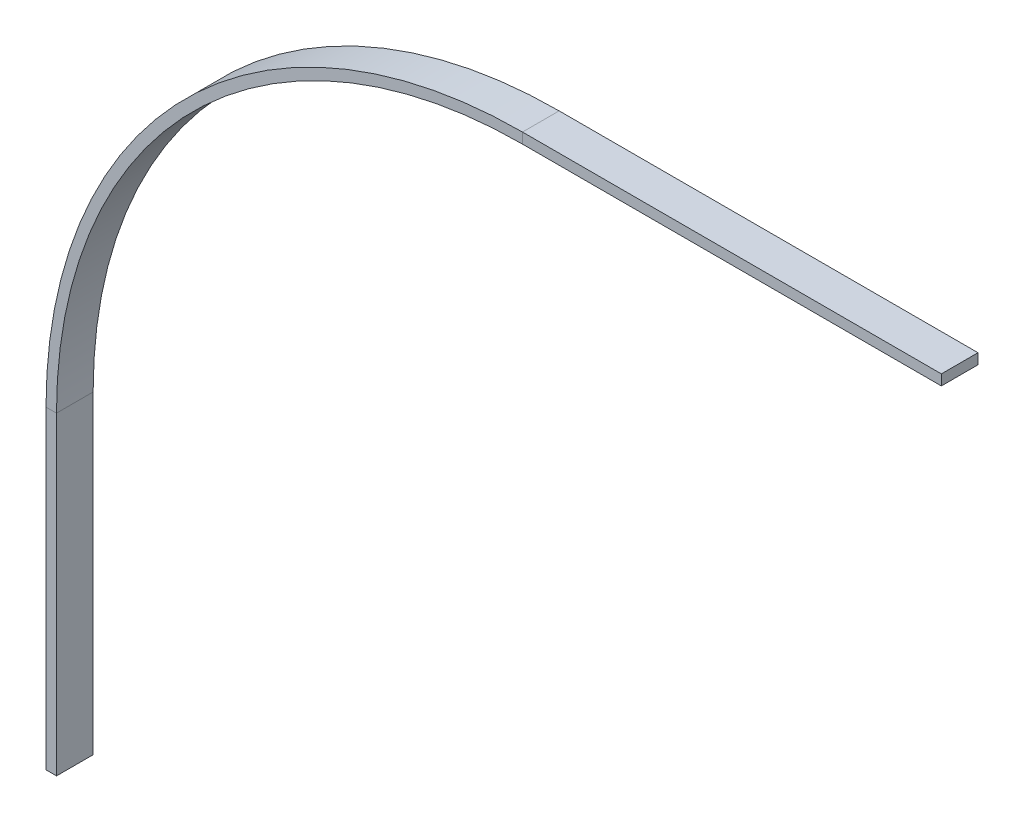
ISO-10303-21;
HEADER;
FILE_DESCRIPTION(('STEP AP214'),'2;1');
FILE_NAME('part.step','',(''),(''),'','','');
FILE_SCHEMA(('AUTOMOTIVE_DESIGN { 1 0 10303 214 1 1 1 1 }'));
ENDSEC;
DATA;
#1=APPLICATION_CONTEXT('core data for automotive mechanical design processes');
#2=APPLICATION_PROTOCOL_DEFINITION('international standard','automotive_design',2000,#1);
#3=PRODUCT_CONTEXT('',#1,'mechanical');
#4=PRODUCT('Part','Part','',(#3));
#5=PRODUCT_RELATED_PRODUCT_CATEGORY('part','',(#4));
#6=PRODUCT_DEFINITION_FORMATION('','',#4);
#7=PRODUCT_DEFINITION_CONTEXT('part definition',#1,'design');
#8=PRODUCT_DEFINITION('design','',#6,#7);
#9=PRODUCT_DEFINITION_SHAPE('','',#8);
#10=(LENGTH_UNIT() NAMED_UNIT(*) SI_UNIT(.MILLI.,.METRE.));
#11=(NAMED_UNIT(*) PLANE_ANGLE_UNIT() SI_UNIT($,.RADIAN.));
#12=(NAMED_UNIT(*) SI_UNIT($,.STERADIAN.) SOLID_ANGLE_UNIT());
#13=UNCERTAINTY_MEASURE_WITH_UNIT(LENGTH_MEASURE(1.E-05),#10,'distance_accuracy_value','');
#14=(GEOMETRIC_REPRESENTATION_CONTEXT(3) GLOBAL_UNCERTAINTY_ASSIGNED_CONTEXT((#13)) GLOBAL_UNIT_ASSIGNED_CONTEXT((#10,
#11,#12)) REPRESENTATION_CONTEXT('',''));
#15=CARTESIAN_POINT('',(0.,0.,0.));
#16=DIRECTION('',(0.,0.,1.));
#17=DIRECTION('',(1.,0.,0.));
#18=AXIS2_PLACEMENT_3D('',#15,#16,#17);
#19=CARTESIAN_POINT('',(40.0000000464551,74.5019277988441,-7.5));
#20=DIRECTION('',(0.,0.,-1.));
#21=DIRECTION('',(-1.,0.,0.));
#22=AXIS2_PLACEMENT_3D('',#19,#20,#21);
#23=PLANE('',#22);
#24=DIRECTION('',(4.81949710834372E-05,0.999999998838622,0.));
#25=VECTOR('',#24,1.);
#26=CARTESIAN_POINT('',(40.0000000464551,74.5019277988441,-7.5));
#27=LINE('',#26,#25);
#28=CARTESIAN_POINT('',(40.0000000464551,74.5019277988441,-7.5));
#29=VERTEX_POINT('',#28);
#30=CARTESIAN_POINT('',(40.0000482414262,75.5019277976828,-7.5));
#31=VERTEX_POINT('',#30);
#32=EDGE_CURVE('E12',#29,#31,#27,.T.);
#33=ORIENTED_EDGE('',*,*,#32,.F.);
#34=CARTESIAN_POINT('',(39.9978552729575,29.9999093103118,-7.5));
#35=DIRECTION('',(0.,0.,-1.));
#36=DIRECTION('',(-1.,0.,0.));
#37=AXIS2_PLACEMENT_3D('',#34,#35,#36);
#38=CIRCLE('',#37,44.502018540216);
#39=CARTESIAN_POINT('',(-4.50416326716609,30.,-7.5));
#40=VERTEX_POINT('',#39);
#41=EDGE_CURVE('E173',#40,#29,#38,.T.);
#42=ORIENTED_EDGE('',*,*,#41,.F.);
#43=DIRECTION('',(0.999999999997924,-2.03787669786561E-06,0.));
#44=VECTOR('',#43,1.);
#45=CARTESIAN_POINT('',(-5.50416327707822,30.0000020378767,-7.5));
#46=LINE('',#45,#44);
#47=CARTESIAN_POINT('',(-5.50416327707822,30.0000020378767,-7.5));
#48=VERTEX_POINT('',#47);
#49=EDGE_CURVE('E61',#48,#40,#46,.T.);
#50=ORIENTED_EDGE('',*,*,#49,.F.);
#51=CARTESIAN_POINT('',(39.9978552729575,29.9999093103118,-7.5));
#52=DIRECTION('',(0.,0.,1.));
#53=DIRECTION('',(1.,0.,0.));
#54=AXIS2_PLACEMENT_3D('',#51,#52,#53);
#55=CIRCLE('',#54,45.502018540216);
#56=EDGE_CURVE('E230',#48,#31,#55,.F.);
#57=ORIENTED_EDGE('',*,*,#56,.T.);
#58=EDGE_LOOP('',(#33,#42,#50,#57));
#59=FACE_BOUND('',#58,.T.);
#60=ADVANCED_FACE('F51',(#59),#23,.T.);
#61=CARTESIAN_POINT('',(-5.50416327707822,30.0000020378767,-7.5));
#62=DIRECTION('',(0.,0.,-1.));
#63=DIRECTION('',(-1.,0.,0.));
#64=AXIS2_PLACEMENT_3D('',#61,#62,#63);
#65=PLANE('',#64);
#66=DIRECTION('',(0.999999998838622,-4.81949711032131E-05,0.));
#67=VECTOR('',#66,1.);
#68=CARTESIAN_POINT('',(80.,74.5,-7.5));
#69=LINE('',#68,#67);
#70=CARTESIAN_POINT('',(80.,74.5,-7.5));
#71=VERTEX_POINT('',#70);
#72=EDGE_CURVE('E241',#29,#71,#69,.T.);
#73=ORIENTED_EDGE('',*,*,#72,.F.);
#74=ORIENTED_EDGE('',*,*,#32,.T.);
#75=DIRECTION('',(0.999999998838623,-4.81949711032131E-05,0.));
#76=VECTOR('',#75,1.);
#77=CARTESIAN_POINT('',(80.0000481949711,75.4999999988386,-7.5));
#78=LINE('',#77,#76);
#79=CARTESIAN_POINT('',(80.0000481949711,75.4999999988386,-7.5));
#80=VERTEX_POINT('',#79);
#81=EDGE_CURVE('E233',#31,#80,#78,.T.);
#82=ORIENTED_EDGE('',*,*,#81,.T.);
#83=DIRECTION('',(-4.8194971097315E-05,-0.999999998838622,0.));
#84=VECTOR('',#83,1.);
#85=CARTESIAN_POINT('',(80.0000481949711,75.4999999988386,-7.5));
#86=LINE('',#85,#84);
#87=EDGE_CURVE('E130',#80,#71,#86,.T.);
#88=ORIENTED_EDGE('',*,*,#87,.T.);
#89=EDGE_LOOP('',(#73,#74,#82,#88));
#90=FACE_BOUND('',#89,.T.);
#91=ADVANCED_FACE('F296',(#90),#65,.T.);
#92=CARTESIAN_POINT('',(-4.50416326716609,30.,-4.));
#93=DIRECTION('',(0.,0.,1.));
#94=DIRECTION('',(1.,0.,0.));
#95=AXIS2_PLACEMENT_3D('',#92,#93,#94);
#96=PLANE('',#95);
#97=DIRECTION('',(-0.999999999997924,2.03787669786561E-06,0.));
#98=VECTOR('',#97,1.);
#99=CARTESIAN_POINT('',(-4.50416326716609,30.,-4.));
#100=LINE('',#99,#98);
#101=CARTESIAN_POINT('',(-4.50416326716609,30.,-4.));
#102=VERTEX_POINT('',#101);
#103=CARTESIAN_POINT('',(-5.50416327707822,30.0000020378767,-4.));
#104=VERTEX_POINT('',#103);
#105=EDGE_CURVE('E109',#102,#104,#100,.T.);
#106=ORIENTED_EDGE('',*,*,#105,.F.);
#107=CARTESIAN_POINT('',(39.9978552729575,29.9999093103118,-4.));
#108=DIRECTION('',(0.,0.,-1.));
#109=DIRECTION('',(-1.,0.,0.));
#110=AXIS2_PLACEMENT_3D('',#107,#108,#109);
#111=CIRCLE('',#110,44.502018540216);
#112=CARTESIAN_POINT('',(40.0000000464551,74.5019277988441,-4.));
#113=VERTEX_POINT('',#112);
#114=EDGE_CURVE('E199',#102,#113,#111,.T.);
#115=ORIENTED_EDGE('',*,*,#114,.T.);
#116=DIRECTION('',(-4.81949710834372E-05,-0.999999998838622,0.));
#117=VECTOR('',#116,1.);
#118=CARTESIAN_POINT('',(40.0000482414262,75.5019277976828,-4.));
#119=LINE('',#118,#117);
#120=CARTESIAN_POINT('',(40.0000482414262,75.5019277976828,-4.));
#121=VERTEX_POINT('',#120);
#122=EDGE_CURVE('E119',#121,#113,#119,.T.);
#123=ORIENTED_EDGE('',*,*,#122,.F.);
#124=CARTESIAN_POINT('',(39.9978552729575,29.9999093103118,-4.));
#125=DIRECTION('',(0.,0.,1.));
#126=DIRECTION('',(1.,0.,0.));
#127=AXIS2_PLACEMENT_3D('',#124,#125,#126);
#128=CIRCLE('',#127,45.502018540216);
#129=EDGE_CURVE('E222',#104,#121,#128,.F.);
#130=ORIENTED_EDGE('',*,*,#129,.F.);
#131=EDGE_LOOP('',(#106,#115,#123,#130));
#132=FACE_BOUND('',#131,.T.);
#133=ADVANCED_FACE('F249',(#132),#96,.T.);
#134=CARTESIAN_POINT('',(40.0000482414262,75.5019277976828,-4.));
#135=DIRECTION('',(0.,0.,1.));
#136=DIRECTION('',(1.,0.,0.));
#137=AXIS2_PLACEMENT_3D('',#134,#135,#136);
#138=PLANE('',#137);
#139=DIRECTION('',(-0.000138775570866489,0.99999999037067,0.));
#140=VECTOR('',#139,1.);
#141=CARTESIAN_POINT('',(-4.5,0.,-4.));
#142=LINE('',#141,#140);
#143=CARTESIAN_POINT('',(-4.5,0.,-4.));
#144=VERTEX_POINT('',#143);
#145=EDGE_CURVE('E153',#144,#102,#142,.T.);
#146=ORIENTED_EDGE('',*,*,#145,.T.);
#147=ORIENTED_EDGE('',*,*,#105,.T.);
#148=DIRECTION('',(-0.000138775570866489,0.999999990370671,0.));
#149=VECTOR('',#148,1.);
#150=CARTESIAN_POINT('',(-5.49999999037067,-0.000138775570866489,-4.));
#151=LINE('',#150,#149);
#152=CARTESIAN_POINT('',(-5.49999999037067,-0.000138775570866489,-4.));
#153=VERTEX_POINT('',#152);
#154=EDGE_CURVE('E217',#153,#104,#151,.T.);
#155=ORIENTED_EDGE('',*,*,#154,.F.);
#156=DIRECTION('',(-0.99999999037067,-0.000138775570866489,0.));
#157=VECTOR('',#156,1.);
#158=CARTESIAN_POINT('',(-4.5,0.,-4.));
#159=LINE('',#158,#157);
#160=EDGE_CURVE('E214',#144,#153,#159,.T.);
#161=ORIENTED_EDGE('',*,*,#160,.F.);
#162=EDGE_LOOP('',(#146,#147,#155,#161));
#163=FACE_BOUND('',#162,.T.);
#164=ADVANCED_FACE('F303',(#163),#138,.T.);
#165=CARTESIAN_POINT('',(80.,74.5,-7.5));
#166=DIRECTION('',(-4.81949711032131E-05,-0.999999998838623,0.));
#167=DIRECTION('',(0.999999998838622,-4.81949711032131E-05,0.));
#168=AXIS2_PLACEMENT_3D('',#165,#166,#167);
#169=PLANE('',#168);
#170=DIRECTION('',(0.999999998838622,-4.81949711032131E-05,0.));
#171=VECTOR('',#170,1.);
#172=CARTESIAN_POINT('',(80.,74.5,-4.));
#173=LINE('',#172,#171);
#174=CARTESIAN_POINT('',(80.,74.5,-4.));
#175=VERTEX_POINT('',#174);
#176=EDGE_CURVE('E183',#113,#175,#173,.T.);
#177=ORIENTED_EDGE('',*,*,#176,.F.);
#178=DIRECTION('',(0.,0.,1.));
#179=VECTOR('',#178,1.);
#180=CARTESIAN_POINT('',(40.0000000464551,74.5019277988441,-7.5));
#181=LINE('',#180,#179);
#182=EDGE_CURVE('E195',#29,#113,#181,.T.);
#183=ORIENTED_EDGE('',*,*,#182,.F.);
#184=ORIENTED_EDGE('',*,*,#72,.T.);
#185=DIRECTION('',(0.,0.,1.));
#186=VECTOR('',#185,1.);
#187=CARTESIAN_POINT('',(80.,74.5,-7.5));
#188=LINE('',#187,#186);
#189=EDGE_CURVE('E177',#71,#175,#188,.T.);
#190=ORIENTED_EDGE('',*,*,#189,.T.);
#191=EDGE_LOOP('',(#177,#183,#184,#190));
#192=FACE_BOUND('',#191,.T.);
#193=ADVANCED_FACE('F254',(#192),#169,.T.);
#194=CARTESIAN_POINT('',(39.9978552729575,29.9999093103118,-7.5));
#195=DIRECTION('',(0.,0.,1.));
#196=DIRECTION('',(1.,0.,0.));
#197=AXIS2_PLACEMENT_3D('',#194,#195,#196);
#198=CYLINDRICAL_SURFACE('',#197,44.502018540216);
#199=ORIENTED_EDGE('',*,*,#114,.F.);
#200=DIRECTION('',(0.,0.,1.));
#201=VECTOR('',#200,1.);
#202=CARTESIAN_POINT('',(-4.50416326716609,30.,-7.5));
#203=LINE('',#202,#201);
#204=EDGE_CURVE('E157',#40,#102,#203,.T.);
#205=ORIENTED_EDGE('',*,*,#204,.F.);
#206=ORIENTED_EDGE('',*,*,#41,.T.);
#207=ORIENTED_EDGE('',*,*,#182,.T.);
#208=EDGE_LOOP('',(#199,#205,#206,#207));
#209=FACE_BOUND('',#208,.T.);
#210=ADVANCED_FACE('F252',(#209),#198,.F.);
#211=CARTESIAN_POINT('',(-4.5,0.,-7.5));
#212=DIRECTION('',(0.99999999037067,0.000138775570866489,0.));
#213=DIRECTION('',(-0.000138775570866489,0.999999990370671,0.));
#214=AXIS2_PLACEMENT_3D('',#211,#212,#213);
#215=PLANE('',#214);
#216=ORIENTED_EDGE('',*,*,#145,.F.);
#217=DIRECTION('',(0.,0.,1.));
#218=VECTOR('',#217,1.);
#219=CARTESIAN_POINT('',(-4.5,0.,-7.5));
#220=LINE('',#219,#218);
#221=CARTESIAN_POINT('',(-4.5,0.,-7.5));
#222=VERTEX_POINT('',#221);
#223=EDGE_CURVE('E147',#222,#144,#220,.T.);
#224=ORIENTED_EDGE('',*,*,#223,.F.);
#225=DIRECTION('',(-0.000138775570866489,0.99999999037067,0.));
#226=VECTOR('',#225,1.);
#227=CARTESIAN_POINT('',(-4.5,0.,-7.5));
#228=LINE('',#227,#226);
#229=EDGE_CURVE('E151',#222,#40,#228,.T.);
#230=ORIENTED_EDGE('',*,*,#229,.T.);
#231=ORIENTED_EDGE('',*,*,#204,.T.);
#232=EDGE_LOOP('',(#216,#224,#230,#231));
#233=FACE_BOUND('',#232,.T.);
#234=ADVANCED_FACE('F149',(#233),#215,.T.);
#235=CARTESIAN_POINT('',(-4.5,0.,-7.5));
#236=DIRECTION('',(-0.000138775570866489,0.99999999037067,0.));
#237=DIRECTION('',(-0.999999990370671,-0.000138775570866489,0.));
#238=AXIS2_PLACEMENT_3D('',#235,#236,#237);
#239=PLANE('',#238);
#240=ORIENTED_EDGE('',*,*,#160,.T.);
#241=DIRECTION('',(0.,0.,1.));
#242=VECTOR('',#241,1.);
#243=CARTESIAN_POINT('',(-5.49999999037067,-0.000138775570866489,-7.5));
#244=LINE('',#243,#242);
#245=CARTESIAN_POINT('',(-5.49999999037067,-0.000138775570866489,-7.5));
#246=VERTEX_POINT('',#245);
#247=EDGE_CURVE('E158',#246,#153,#244,.T.);
#248=ORIENTED_EDGE('',*,*,#247,.F.);
#249=DIRECTION('',(-0.99999999037067,-0.000138775570866489,0.));
#250=VECTOR('',#249,1.);
#251=CARTESIAN_POINT('',(-4.5,0.,-7.5));
#252=LINE('',#251,#250);
#253=EDGE_CURVE('E161',#222,#246,#252,.T.);
#254=ORIENTED_EDGE('',*,*,#253,.F.);
#255=ORIENTED_EDGE('',*,*,#223,.T.);
#256=EDGE_LOOP('',(#240,#248,#254,#255));
#257=FACE_BOUND('',#256,.T.);
#258=ADVANCED_FACE('F162',(#257),#239,.F.);
#259=CARTESIAN_POINT('',(-5.49999999037067,-0.000138775570866489,-7.5));
#260=DIRECTION('',(0.99999999037067,0.000138775570866489,0.));
#261=DIRECTION('',(-0.000138775570866489,0.99999999037067,0.));
#262=AXIS2_PLACEMENT_3D('',#259,#260,#261);
#263=PLANE('',#262);
#264=ORIENTED_EDGE('',*,*,#154,.T.);
#265=DIRECTION('',(0.,0.,1.));
#266=VECTOR('',#265,1.);
#267=CARTESIAN_POINT('',(-5.50416327707822,30.0000020378767,-7.5));
#268=LINE('',#267,#266);
#269=EDGE_CURVE('E281',#48,#104,#268,.T.);
#270=ORIENTED_EDGE('',*,*,#269,.F.);
#271=DIRECTION('',(-0.000138775570866489,0.999999990370671,0.));
#272=VECTOR('',#271,1.);
#273=CARTESIAN_POINT('',(-5.49999999037067,-0.000138775570866489,-7.5));
#274=LINE('',#273,#272);
#275=EDGE_CURVE('E168',#246,#48,#274,.T.);
#276=ORIENTED_EDGE('',*,*,#275,.F.);
#277=ORIENTED_EDGE('',*,*,#247,.T.);
#278=EDGE_LOOP('',(#264,#270,#276,#277));
#279=FACE_BOUND('',#278,.T.);
#280=ADVANCED_FACE('F320',(#279),#263,.F.);
#281=CARTESIAN_POINT('',(39.9978552729575,29.9999093103118,-7.5));
#282=DIRECTION('',(0.,0.,1.));
#283=DIRECTION('',(1.,0.,0.));
#284=AXIS2_PLACEMENT_3D('',#281,#282,#283);
#285=CYLINDRICAL_SURFACE('',#284,45.502018540216);
#286=ORIENTED_EDGE('',*,*,#129,.T.);
#287=DIRECTION('',(0.,0.,1.));
#288=VECTOR('',#287,1.);
#289=CARTESIAN_POINT('',(40.0000482414262,75.5019277976828,-7.5));
#290=LINE('',#289,#288);
#291=EDGE_CURVE('E278',#31,#121,#290,.T.);
#292=ORIENTED_EDGE('',*,*,#291,.F.);
#293=ORIENTED_EDGE('',*,*,#56,.F.);
#294=ORIENTED_EDGE('',*,*,#269,.T.);
#295=EDGE_LOOP('',(#286,#292,#293,#294));
#296=FACE_BOUND('',#295,.T.);
#297=ADVANCED_FACE('F276',(#296),#285,.T.);
#298=CARTESIAN_POINT('',(80.0000481949711,75.4999999988386,-7.5));
#299=DIRECTION('',(-4.81949711032131E-05,-0.999999998838622,0.));
#300=DIRECTION('',(0.999999998838622,-4.81949711032131E-05,0.));
#301=AXIS2_PLACEMENT_3D('',#298,#299,#300);
#302=PLANE('',#301);
#303=DIRECTION('',(0.999999998838623,-4.81949711032131E-05,0.));
#304=VECTOR('',#303,1.);
#305=CARTESIAN_POINT('',(80.0000481949711,75.4999999988386,-4.));
#306=LINE('',#305,#304);
#307=CARTESIAN_POINT('',(80.0000481949711,75.4999999988386,-4.));
#308=VERTEX_POINT('',#307);
#309=EDGE_CURVE('E262',#121,#308,#306,.T.);
#310=ORIENTED_EDGE('',*,*,#309,.T.);
#311=DIRECTION('',(0.,0.,1.));
#312=VECTOR('',#311,1.);
#313=CARTESIAN_POINT('',(80.0000481949711,75.4999999988386,-7.5));
#314=LINE('',#313,#312);
#315=EDGE_CURVE('E284',#80,#308,#314,.T.);
#316=ORIENTED_EDGE('',*,*,#315,.F.);
#317=ORIENTED_EDGE('',*,*,#81,.F.);
#318=ORIENTED_EDGE('',*,*,#291,.T.);
#319=EDGE_LOOP('',(#310,#316,#317,#318));
#320=FACE_BOUND('',#319,.T.);
#321=ADVANCED_FACE('F282',(#320),#302,.F.);
#322=CARTESIAN_POINT('',(80.0000481949711,75.4999999988386,-7.5));
#323=DIRECTION('',(-0.999999998838623,4.8194971097315E-05,0.));
#324=DIRECTION('',(-4.8194971097315E-05,-0.999999998838622,0.));
#325=AXIS2_PLACEMENT_3D('',#322,#323,#324);
#326=PLANE('',#325);
#327=DIRECTION('',(-4.8194971097315E-05,-0.999999998838622,0.));
#328=VECTOR('',#327,1.);
#329=CARTESIAN_POINT('',(80.0000481949711,75.4999999988386,-4.));
#330=LINE('',#329,#328);
#331=EDGE_CURVE('E258',#308,#175,#330,.T.);
#332=ORIENTED_EDGE('',*,*,#331,.T.);
#333=ORIENTED_EDGE('',*,*,#189,.F.);
#334=ORIENTED_EDGE('',*,*,#87,.F.);
#335=ORIENTED_EDGE('',*,*,#315,.T.);
#336=EDGE_LOOP('',(#332,#333,#334,#335));
#337=FACE_BOUND('',#336,.T.);
#338=ADVANCED_FACE('F292',(#337),#326,.F.);
#339=CARTESIAN_POINT('',(39.9978552729575,29.9999093103118,-7.5));
#340=DIRECTION('',(0.,0.,1.));
#341=DIRECTION('',(1.,0.,0.));
#342=AXIS2_PLACEMENT_3D('',#339,#340,#341);
#343=PLANE('',#342);
#344=ORIENTED_EDGE('',*,*,#275,.T.);
#345=ORIENTED_EDGE('',*,*,#49,.T.);
#346=ORIENTED_EDGE('',*,*,#229,.F.);
#347=ORIENTED_EDGE('',*,*,#253,.T.);
#348=EDGE_LOOP('',(#344,#345,#346,#347));
#349=FACE_BOUND('',#348,.T.);
#350=ADVANCED_FACE('F170',(#349),#343,.F.);
#351=CARTESIAN_POINT('',(39.9978552729575,29.9999093103118,-4.));
#352=DIRECTION('',(0.,0.,1.));
#353=DIRECTION('',(1.,0.,0.));
#354=AXIS2_PLACEMENT_3D('',#351,#352,#353);
#355=PLANE('',#354);
#356=ORIENTED_EDGE('',*,*,#176,.T.);
#357=ORIENTED_EDGE('',*,*,#331,.F.);
#358=ORIENTED_EDGE('',*,*,#309,.F.);
#359=ORIENTED_EDGE('',*,*,#122,.T.);
#360=EDGE_LOOP('',(#356,#357,#358,#359));
#361=FACE_BOUND('',#360,.T.);
#362=ADVANCED_FACE('F286',(#361),#355,.T.);
#363=CLOSED_SHELL('',(#60,#91,#133,#164,#193,#210,#234,#258,#280,#297,#321,#338,#350,#362));
#364=MANIFOLD_SOLID_BREP('B2',#363);
#365=ADVANCED_BREP_SHAPE_REPRESENTATION('',(#18,#364),#14);
#366=SHAPE_DEFINITION_REPRESENTATION(#9,#365);
ENDSEC;
END-ISO-10303-21;
